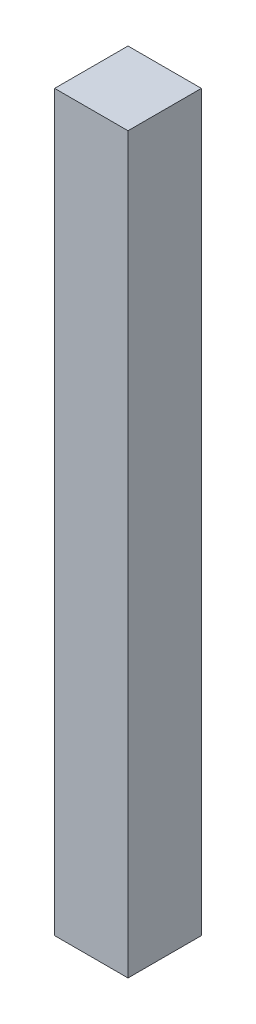
ISO-10303-21;
HEADER;
FILE_DESCRIPTION(('STEP AP214'),'2;1');
FILE_NAME('part.step','',(''),(''),'','','');
FILE_SCHEMA(('AUTOMOTIVE_DESIGN { 1 0 10303 214 1 1 1 1 }'));
ENDSEC;
DATA;
#1=APPLICATION_CONTEXT('core data for automotive mechanical design processes');
#2=APPLICATION_PROTOCOL_DEFINITION('international standard','automotive_design',2000,#1);
#3=PRODUCT_CONTEXT('',#1,'mechanical');
#4=PRODUCT('Part','Part','',(#3));
#5=PRODUCT_RELATED_PRODUCT_CATEGORY('part','',(#4));
#6=PRODUCT_DEFINITION_FORMATION('','',#4);
#7=PRODUCT_DEFINITION_CONTEXT('part definition',#1,'design');
#8=PRODUCT_DEFINITION('design','',#6,#7);
#9=PRODUCT_DEFINITION_SHAPE('','',#8);
#10=(LENGTH_UNIT() NAMED_UNIT(*) SI_UNIT(.MILLI.,.METRE.));
#11=(NAMED_UNIT(*) PLANE_ANGLE_UNIT() SI_UNIT($,.RADIAN.));
#12=(NAMED_UNIT(*) SI_UNIT($,.STERADIAN.) SOLID_ANGLE_UNIT());
#13=UNCERTAINTY_MEASURE_WITH_UNIT(LENGTH_MEASURE(1.E-05),#10,'distance_accuracy_value','');
#14=(GEOMETRIC_REPRESENTATION_CONTEXT(3) GLOBAL_UNCERTAINTY_ASSIGNED_CONTEXT((#13)) GLOBAL_UNIT_ASSIGNED_CONTEXT((#10,
#11,#12)) REPRESENTATION_CONTEXT('',''));
#15=CARTESIAN_POINT('',(0.,0.,0.));
#16=DIRECTION('',(0.,0.,1.));
#17=DIRECTION('',(1.,0.,0.));
#18=AXIS2_PLACEMENT_3D('',#15,#16,#17);
#19=CARTESIAN_POINT('',(0.,0.,20.));
#20=DIRECTION('',(1.,0.,0.));
#21=DIRECTION('',(0.,1.,0.));
#22=AXIS2_PLACEMENT_3D('',#19,#20,#21);
#23=PLANE('',#22);
#24=DIRECTION('',(0.,-1.,0.));
#25=VECTOR('',#24,1.);
#26=CARTESIAN_POINT('',(0.,0.,0.));
#27=LINE('',#26,#25);
#28=CARTESIAN_POINT('',(0.,200.,0.));
#29=VERTEX_POINT('',#28);
#30=CARTESIAN_POINT('',(0.,0.,0.));
#31=VERTEX_POINT('',#30);
#32=EDGE_CURVE('E102',#29,#31,#27,.T.);
#33=ORIENTED_EDGE('',*,*,#32,.T.);
#34=DIRECTION('',(0.,0.,-1.));
#35=VECTOR('',#34,1.);
#36=CARTESIAN_POINT('',(0.,0.,20.));
#37=LINE('',#36,#35);
#38=CARTESIAN_POINT('',(0.,0.,20.));
#39=VERTEX_POINT('',#38);
#40=EDGE_CURVE('E11',#39,#31,#37,.T.);
#41=ORIENTED_EDGE('',*,*,#40,.F.);
#42=DIRECTION('',(0.,-1.,0.));
#43=VECTOR('',#42,1.);
#44=CARTESIAN_POINT('',(0.,0.,20.));
#45=LINE('',#44,#43);
#46=CARTESIAN_POINT('',(0.,200.,20.));
#47=VERTEX_POINT('',#46);
#48=EDGE_CURVE('E90',#47,#39,#45,.T.);
#49=ORIENTED_EDGE('',*,*,#48,.F.);
#50=DIRECTION('',(0.,0.,-1.));
#51=VECTOR('',#50,1.);
#52=CARTESIAN_POINT('',(0.,200.,20.));
#53=LINE('',#52,#51);
#54=EDGE_CURVE('E98',#47,#29,#53,.T.);
#55=ORIENTED_EDGE('',*,*,#54,.T.);
#56=EDGE_LOOP('',(#33,#41,#49,#55));
#57=FACE_BOUND('',#56,.T.);
#58=ADVANCED_FACE('F39',(#57),#23,.F.);
#59=CARTESIAN_POINT('',(0.,0.,20.));
#60=DIRECTION('',(0.,1.,0.));
#61=DIRECTION('',(0.,0.,1.));
#62=AXIS2_PLACEMENT_3D('',#59,#60,#61);
#63=PLANE('',#62);
#64=DIRECTION('',(1.,0.,0.));
#65=VECTOR('',#64,1.);
#66=CARTESIAN_POINT('',(0.,0.,0.));
#67=LINE('',#66,#65);
#68=CARTESIAN_POINT('',(20.,0.,0.));
#69=VERTEX_POINT('',#68);
#70=EDGE_CURVE('E94',#31,#69,#67,.T.);
#71=ORIENTED_EDGE('',*,*,#70,.T.);
#72=DIRECTION('',(0.,0.,-1.));
#73=VECTOR('',#72,1.);
#74=CARTESIAN_POINT('',(20.,0.,20.));
#75=LINE('',#74,#73);
#76=CARTESIAN_POINT('',(20.,0.,20.));
#77=VERTEX_POINT('',#76);
#78=EDGE_CURVE('E47',#77,#69,#75,.T.);
#79=ORIENTED_EDGE('',*,*,#78,.F.);
#80=DIRECTION('',(1.,0.,0.));
#81=VECTOR('',#80,1.);
#82=CARTESIAN_POINT('',(0.,0.,20.));
#83=LINE('',#82,#81);
#84=EDGE_CURVE('E85',#39,#77,#83,.T.);
#85=ORIENTED_EDGE('',*,*,#84,.F.);
#86=ORIENTED_EDGE('',*,*,#40,.T.);
#87=EDGE_LOOP('',(#71,#79,#85,#86));
#88=FACE_BOUND('',#87,.T.);
#89=ADVANCED_FACE('F93',(#88),#63,.F.);
#90=CARTESIAN_POINT('',(20.,0.,20.));
#91=DIRECTION('',(-1.,0.,0.));
#92=DIRECTION('',(0.,-1.,0.));
#93=AXIS2_PLACEMENT_3D('',#90,#91,#92);
#94=PLANE('',#93);
#95=DIRECTION('',(0.,1.,0.));
#96=VECTOR('',#95,1.);
#97=CARTESIAN_POINT('',(20.,0.,0.));
#98=LINE('',#97,#96);
#99=CARTESIAN_POINT('',(20.,200.,0.));
#100=VERTEX_POINT('',#99);
#101=EDGE_CURVE('E72',#69,#100,#98,.T.);
#102=ORIENTED_EDGE('',*,*,#101,.T.);
#103=DIRECTION('',(0.,0.,-1.));
#104=VECTOR('',#103,1.);
#105=CARTESIAN_POINT('',(20.,200.,20.));
#106=LINE('',#105,#104);
#107=CARTESIAN_POINT('',(20.,200.,20.));
#108=VERTEX_POINT('',#107);
#109=EDGE_CURVE('E95',#108,#100,#106,.T.);
#110=ORIENTED_EDGE('',*,*,#109,.F.);
#111=DIRECTION('',(0.,1.,0.));
#112=VECTOR('',#111,1.);
#113=CARTESIAN_POINT('',(20.,0.,20.));
#114=LINE('',#113,#112);
#115=EDGE_CURVE('E88',#77,#108,#114,.T.);
#116=ORIENTED_EDGE('',*,*,#115,.F.);
#117=ORIENTED_EDGE('',*,*,#78,.T.);
#118=EDGE_LOOP('',(#102,#110,#116,#117));
#119=FACE_BOUND('',#118,.T.);
#120=ADVANCED_FACE('F96',(#119),#94,.F.);
#121=CARTESIAN_POINT('',(0.,200.,20.));
#122=DIRECTION('',(0.,-1.,0.));
#123=DIRECTION('',(0.,0.,-1.));
#124=AXIS2_PLACEMENT_3D('',#121,#122,#123);
#125=PLANE('',#124);
#126=DIRECTION('',(-1.,0.,0.));
#127=VECTOR('',#126,1.);
#128=CARTESIAN_POINT('',(0.,200.,0.));
#129=LINE('',#128,#127);
#130=EDGE_CURVE('E78',#100,#29,#129,.T.);
#131=ORIENTED_EDGE('',*,*,#130,.T.);
#132=ORIENTED_EDGE('',*,*,#54,.F.);
#133=DIRECTION('',(-1.,0.,0.));
#134=VECTOR('',#133,1.);
#135=CARTESIAN_POINT('',(0.,200.,20.));
#136=LINE('',#135,#134);
#137=EDGE_CURVE('E55',#108,#47,#136,.T.);
#138=ORIENTED_EDGE('',*,*,#137,.F.);
#139=ORIENTED_EDGE('',*,*,#109,.T.);
#140=EDGE_LOOP('',(#131,#132,#138,#139));
#141=FACE_BOUND('',#140,.T.);
#142=ADVANCED_FACE('F109',(#141),#125,.F.);
#143=CARTESIAN_POINT('',(0.,0.,20.));
#144=DIRECTION('',(0.,0.,-1.));
#145=DIRECTION('',(-1.,0.,0.));
#146=AXIS2_PLACEMENT_3D('',#143,#144,#145);
#147=PLANE('',#146);
#148=ORIENTED_EDGE('',*,*,#48,.T.);
#149=ORIENTED_EDGE('',*,*,#84,.T.);
#150=ORIENTED_EDGE('',*,*,#115,.T.);
#151=ORIENTED_EDGE('',*,*,#137,.T.);
#152=EDGE_LOOP('',(#148,#149,#150,#151));
#153=FACE_BOUND('',#152,.T.);
#154=ADVANCED_FACE('F86',(#153),#147,.F.);
#155=CARTESIAN_POINT('',(0.,0.,0.));
#156=DIRECTION('',(0.,0.,-1.));
#157=DIRECTION('',(-1.,0.,0.));
#158=AXIS2_PLACEMENT_3D('',#155,#156,#157);
#159=PLANE('',#158);
#160=ORIENTED_EDGE('',*,*,#32,.F.);
#161=ORIENTED_EDGE('',*,*,#130,.F.);
#162=ORIENTED_EDGE('',*,*,#101,.F.);
#163=ORIENTED_EDGE('',*,*,#70,.F.);
#164=EDGE_LOOP('',(#160,#161,#162,#163));
#165=FACE_BOUND('',#164,.T.);
#166=ADVANCED_FACE('F112',(#165),#159,.T.);
#167=CLOSED_SHELL('',(#58,#89,#120,#142,#154,#166));
#168=MANIFOLD_SOLID_BREP('B2',#167);
#169=ADVANCED_BREP_SHAPE_REPRESENTATION('',(#18,#168),#14);
#170=SHAPE_DEFINITION_REPRESENTATION(#9,#169);
ENDSEC;
END-ISO-10303-21;
